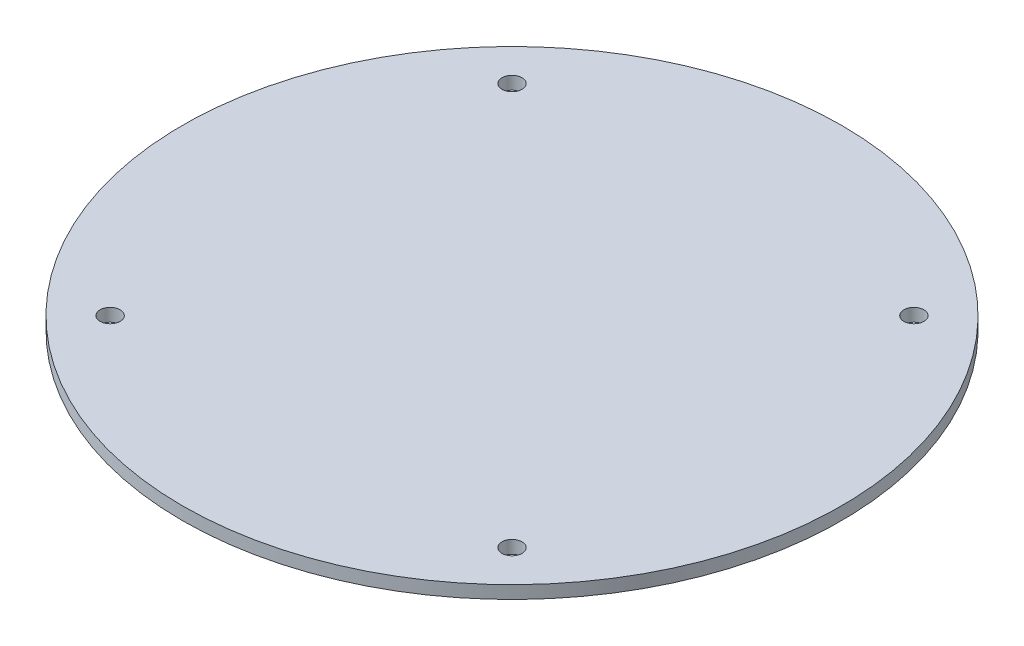
ISO-10303-21;
HEADER;
FILE_DESCRIPTION(('STEP AP214'),'2;1');
FILE_NAME('part.step','',(''),(''),'','','');
FILE_SCHEMA(('AUTOMOTIVE_DESIGN { 1 0 10303 214 1 1 1 1 }'));
ENDSEC;
DATA;
#1=APPLICATION_CONTEXT('core data for automotive mechanical design processes');
#2=APPLICATION_PROTOCOL_DEFINITION('international standard','automotive_design',2000,#1);
#3=PRODUCT_CONTEXT('',#1,'mechanical');
#4=PRODUCT('Part','Part','',(#3));
#5=PRODUCT_RELATED_PRODUCT_CATEGORY('part','',(#4));
#6=PRODUCT_DEFINITION_FORMATION('','',#4);
#7=PRODUCT_DEFINITION_CONTEXT('part definition',#1,'design');
#8=PRODUCT_DEFINITION('design','',#6,#7);
#9=PRODUCT_DEFINITION_SHAPE('','',#8);
#10=(LENGTH_UNIT() NAMED_UNIT(*) SI_UNIT(.MILLI.,.METRE.));
#11=(NAMED_UNIT(*) PLANE_ANGLE_UNIT() SI_UNIT($,.RADIAN.));
#12=(NAMED_UNIT(*) SI_UNIT($,.STERADIAN.) SOLID_ANGLE_UNIT());
#13=UNCERTAINTY_MEASURE_WITH_UNIT(LENGTH_MEASURE(1.E-05),#10,'distance_accuracy_value','');
#14=(GEOMETRIC_REPRESENTATION_CONTEXT(3) GLOBAL_UNCERTAINTY_ASSIGNED_CONTEXT((#13)) GLOBAL_UNIT_ASSIGNED_CONTEXT((#10,
#11,#12)) REPRESENTATION_CONTEXT('',''));
#15=CARTESIAN_POINT('',(0.,0.,0.));
#16=DIRECTION('',(0.,0.,1.));
#17=DIRECTION('',(1.,0.,0.));
#18=AXIS2_PLACEMENT_3D('',#15,#16,#17);
#19=CARTESIAN_POINT('',(0.,0.,0.));
#20=DIRECTION('',(0.,1.,0.));
#21=DIRECTION('',(0.,0.,1.));
#22=AXIS2_PLACEMENT_3D('',#19,#20,#21);
#23=PLANE('',#22);
#24=CARTESIAN_POINT('',(0.,0.,0.));
#25=DIRECTION('',(0.,-1.,0.));
#26=DIRECTION('',(0.,0.,-1.));
#27=AXIS2_PLACEMENT_3D('',#24,#25,#26);
#28=CIRCLE('',#27,41.);
#29=CARTESIAN_POINT('',(0.,0.,-41.));
#30=VERTEX_POINT('',#29);
#31=EDGE_CURVE('E36',#30,#30,#28,.F.);
#32=ORIENTED_EDGE('',*,*,#31,.F.);
#33=EDGE_LOOP('',(#32));
#34=FACE_BOUND('',#33,.T.);
#35=CARTESIAN_POINT('',(25.,0.,25.));
#36=DIRECTION('',(0.,-1.,0.));
#37=DIRECTION('',(0.,0.,-1.));
#38=AXIS2_PLACEMENT_3D('',#35,#36,#37);
#39=CIRCLE('',#38,1.25);
#40=CARTESIAN_POINT('',(25.,0.,23.75));
#41=VERTEX_POINT('',#40);
#42=EDGE_CURVE('E39',#41,#41,#39,.F.);
#43=ORIENTED_EDGE('',*,*,#42,.T.);
#44=EDGE_LOOP('',(#43));
#45=FACE_BOUND('',#44,.T.);
#46=CARTESIAN_POINT('',(25.,0.,-25.));
#47=DIRECTION('',(0.,-1.,0.));
#48=DIRECTION('',(0.,0.,-1.));
#49=AXIS2_PLACEMENT_3D('',#46,#47,#48);
#50=CIRCLE('',#49,1.25);
#51=CARTESIAN_POINT('',(25.,0.,-26.25));
#52=VERTEX_POINT('',#51);
#53=EDGE_CURVE('E42',#52,#52,#50,.F.);
#54=ORIENTED_EDGE('',*,*,#53,.T.);
#55=EDGE_LOOP('',(#54));
#56=FACE_BOUND('',#55,.T.);
#57=CARTESIAN_POINT('',(-25.,0.,25.));
#58=DIRECTION('',(0.,-1.,0.));
#59=DIRECTION('',(0.,0.,-1.));
#60=AXIS2_PLACEMENT_3D('',#57,#58,#59);
#61=CIRCLE('',#60,1.25);
#62=CARTESIAN_POINT('',(-25.,0.,23.75));
#63=VERTEX_POINT('',#62);
#64=EDGE_CURVE('E44',#63,#63,#61,.F.);
#65=ORIENTED_EDGE('',*,*,#64,.T.);
#66=EDGE_LOOP('',(#65));
#67=FACE_BOUND('',#66,.T.);
#68=CARTESIAN_POINT('',(-25.,0.,-25.));
#69=DIRECTION('',(0.,-1.,0.));
#70=DIRECTION('',(0.,0.,-1.));
#71=AXIS2_PLACEMENT_3D('',#68,#69,#70);
#72=CIRCLE('',#71,1.25);
#73=CARTESIAN_POINT('',(-25.,0.,-26.25));
#74=VERTEX_POINT('',#73);
#75=EDGE_CURVE('E16',#74,#74,#72,.F.);
#76=ORIENTED_EDGE('',*,*,#75,.T.);
#77=EDGE_LOOP('',(#76));
#78=FACE_BOUND('',#77,.T.);
#79=ADVANCED_FACE('F13',(#34,#45,#56,#67,#78),#23,.F.);
#80=CARTESIAN_POINT('',(-25.,5.13553390593274,-25.));
#81=DIRECTION('',(0.,-1.,0.));
#82=DIRECTION('',(0.,0.,-1.));
#83=AXIS2_PLACEMENT_3D('',#80,#81,#82);
#84=CYLINDRICAL_SURFACE('',#83,1.25);
#85=ORIENTED_EDGE('',*,*,#75,.F.);
#86=EDGE_LOOP('',(#85));
#87=FACE_BOUND('',#86,.T.);
#88=CARTESIAN_POINT('',(-25.,1.6,-25.));
#89=DIRECTION('',(0.,-1.,0.));
#90=DIRECTION('',(0.,0.,-1.));
#91=AXIS2_PLACEMENT_3D('',#88,#89,#90);
#92=CIRCLE('',#91,1.25);
#93=CARTESIAN_POINT('',(-25.,1.6,-26.25));
#94=VERTEX_POINT('',#93);
#95=EDGE_CURVE('E33',#94,#94,#92,.T.);
#96=ORIENTED_EDGE('',*,*,#95,.F.);
#97=EDGE_LOOP('',(#96));
#98=FACE_BOUND('',#97,.T.);
#99=ADVANCED_FACE('F52',(#87,#98),#84,.F.);
#100=CARTESIAN_POINT('',(-25.,5.13553390593274,25.));
#101=DIRECTION('',(0.,-1.,0.));
#102=DIRECTION('',(0.,0.,-1.));
#103=AXIS2_PLACEMENT_3D('',#100,#101,#102);
#104=CYLINDRICAL_SURFACE('',#103,1.25);
#105=ORIENTED_EDGE('',*,*,#64,.F.);
#106=EDGE_LOOP('',(#105));
#107=FACE_BOUND('',#106,.T.);
#108=CARTESIAN_POINT('',(-25.,1.6,25.));
#109=DIRECTION('',(0.,-1.,0.));
#110=DIRECTION('',(0.,0.,-1.));
#111=AXIS2_PLACEMENT_3D('',#108,#109,#110);
#112=CIRCLE('',#111,1.25);
#113=CARTESIAN_POINT('',(-25.,1.6,23.75));
#114=VERTEX_POINT('',#113);
#115=EDGE_CURVE('E30',#114,#114,#112,.T.);
#116=ORIENTED_EDGE('',*,*,#115,.F.);
#117=EDGE_LOOP('',(#116));
#118=FACE_BOUND('',#117,.T.);
#119=ADVANCED_FACE('F55',(#107,#118),#104,.F.);
#120=CARTESIAN_POINT('',(25.,5.13553390593274,-25.));
#121=DIRECTION('',(0.,-1.,0.));
#122=DIRECTION('',(0.,0.,-1.));
#123=AXIS2_PLACEMENT_3D('',#120,#121,#122);
#124=CYLINDRICAL_SURFACE('',#123,1.25);
#125=ORIENTED_EDGE('',*,*,#53,.F.);
#126=EDGE_LOOP('',(#125));
#127=FACE_BOUND('',#126,.T.);
#128=CARTESIAN_POINT('',(25.,1.6,-25.));
#129=DIRECTION('',(0.,-1.,0.));
#130=DIRECTION('',(0.,0.,-1.));
#131=AXIS2_PLACEMENT_3D('',#128,#129,#130);
#132=CIRCLE('',#131,1.25);
#133=CARTESIAN_POINT('',(25.,1.6,-26.25));
#134=VERTEX_POINT('',#133);
#135=EDGE_CURVE('E25',#134,#134,#132,.T.);
#136=ORIENTED_EDGE('',*,*,#135,.F.);
#137=EDGE_LOOP('',(#136));
#138=FACE_BOUND('',#137,.T.);
#139=ADVANCED_FACE('F73',(#127,#138),#124,.F.);
#140=CARTESIAN_POINT('',(25.,5.13553390593274,25.));
#141=DIRECTION('',(0.,-1.,0.));
#142=DIRECTION('',(0.,0.,-1.));
#143=AXIS2_PLACEMENT_3D('',#140,#141,#142);
#144=CYLINDRICAL_SURFACE('',#143,1.25);
#145=ORIENTED_EDGE('',*,*,#42,.F.);
#146=EDGE_LOOP('',(#145));
#147=FACE_BOUND('',#146,.T.);
#148=CARTESIAN_POINT('',(25.,1.6,25.));
#149=DIRECTION('',(0.,-1.,0.));
#150=DIRECTION('',(0.,0.,-1.));
#151=AXIS2_PLACEMENT_3D('',#148,#149,#150);
#152=CIRCLE('',#151,1.25);
#153=CARTESIAN_POINT('',(25.,1.6,23.75));
#154=VERTEX_POINT('',#153);
#155=EDGE_CURVE('E20',#154,#154,#152,.T.);
#156=ORIENTED_EDGE('',*,*,#155,.F.);
#157=EDGE_LOOP('',(#156));
#158=FACE_BOUND('',#157,.T.);
#159=ADVANCED_FACE('F66',(#147,#158),#144,.F.);
#160=CARTESIAN_POINT('',(0.,1.6,0.));
#161=DIRECTION('',(0.,-1.,0.));
#162=DIRECTION('',(0.,0.,-1.));
#163=AXIS2_PLACEMENT_3D('',#160,#161,#162);
#164=CYLINDRICAL_SURFACE('',#163,41.);
#165=ORIENTED_EDGE('',*,*,#31,.T.);
#166=EDGE_LOOP('',(#165));
#167=FACE_BOUND('',#166,.T.);
#168=CARTESIAN_POINT('',(0.,1.6,0.));
#169=DIRECTION('',(0.,-1.,0.));
#170=DIRECTION('',(0.,0.,-1.));
#171=AXIS2_PLACEMENT_3D('',#168,#169,#170);
#172=CIRCLE('',#171,41.);
#173=CARTESIAN_POINT('',(0.,1.6,-41.));
#174=VERTEX_POINT('',#173);
#175=EDGE_CURVE('E9',#174,#174,#172,.F.);
#176=ORIENTED_EDGE('',*,*,#175,.F.);
#177=EDGE_LOOP('',(#176));
#178=FACE_BOUND('',#177,.T.);
#179=ADVANCED_FACE('F60',(#167,#178),#164,.T.);
#180=CARTESIAN_POINT('',(0.,1.6,0.));
#181=DIRECTION('',(0.,1.,0.));
#182=DIRECTION('',(0.,0.,1.));
#183=AXIS2_PLACEMENT_3D('',#180,#181,#182);
#184=PLANE('',#183);
#185=ORIENTED_EDGE('',*,*,#175,.T.);
#186=EDGE_LOOP('',(#185));
#187=FACE_BOUND('',#186,.T.);
#188=ORIENTED_EDGE('',*,*,#155,.T.);
#189=EDGE_LOOP('',(#188));
#190=FACE_BOUND('',#189,.T.);
#191=ORIENTED_EDGE('',*,*,#135,.T.);
#192=EDGE_LOOP('',(#191));
#193=FACE_BOUND('',#192,.T.);
#194=ORIENTED_EDGE('',*,*,#115,.T.);
#195=EDGE_LOOP('',(#194));
#196=FACE_BOUND('',#195,.T.);
#197=ORIENTED_EDGE('',*,*,#95,.T.);
#198=EDGE_LOOP('',(#197));
#199=FACE_BOUND('',#198,.T.);
#200=ADVANCED_FACE('F58',(#187,#190,#193,#196,#199),#184,.T.);
#201=CLOSED_SHELL('',(#79,#99,#119,#139,#159,#179,#200));
#202=MANIFOLD_SOLID_BREP('B1',#201);
#203=ADVANCED_BREP_SHAPE_REPRESENTATION('',(#18,#202),#14);
#204=SHAPE_DEFINITION_REPRESENTATION(#9,#203);
ENDSEC;
END-ISO-10303-21;
